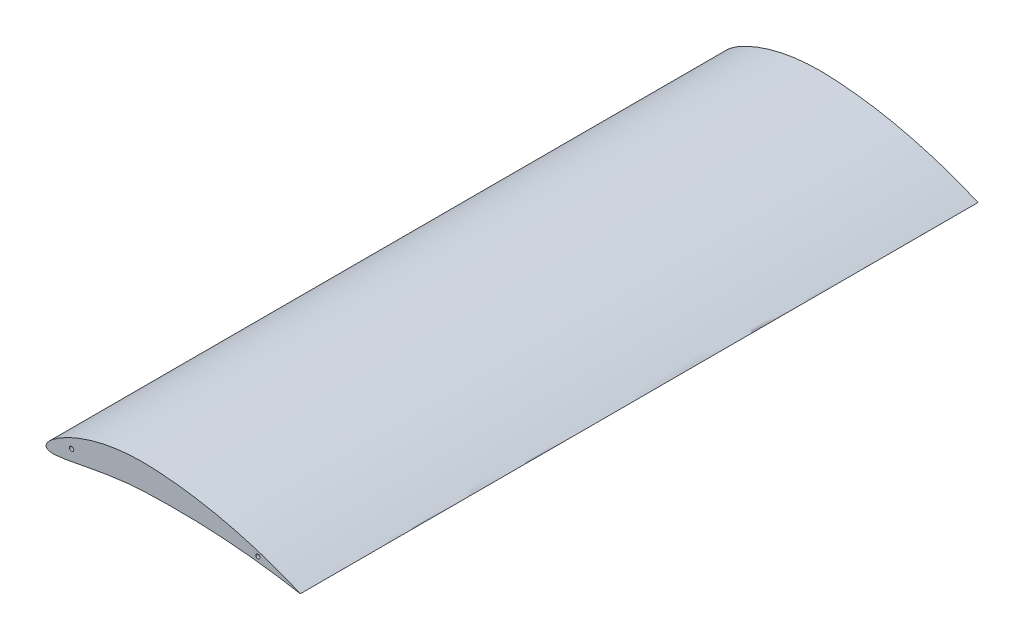
ISO-10303-21;
HEADER;
FILE_DESCRIPTION(('STEP AP214'),'2;1');
FILE_NAME('part.step','',(''),(''),'','','');
FILE_SCHEMA(('AUTOMOTIVE_DESIGN { 1 0 10303 214 1 1 1 1 }'));
ENDSEC;
DATA;
#1=APPLICATION_CONTEXT('core data for automotive mechanical design processes');
#2=APPLICATION_PROTOCOL_DEFINITION('international standard','automotive_design',2000,#1);
#3=PRODUCT_CONTEXT('',#1,'mechanical');
#4=PRODUCT('Part','Part','',(#3));
#5=PRODUCT_RELATED_PRODUCT_CATEGORY('part','',(#4));
#6=PRODUCT_DEFINITION_FORMATION('','',#4);
#7=PRODUCT_DEFINITION_CONTEXT('part definition',#1,'design');
#8=PRODUCT_DEFINITION('design','',#6,#7);
#9=PRODUCT_DEFINITION_SHAPE('','',#8);
#10=(LENGTH_UNIT() NAMED_UNIT(*) SI_UNIT(.MILLI.,.METRE.));
#11=(NAMED_UNIT(*) PLANE_ANGLE_UNIT() SI_UNIT($,.RADIAN.));
#12=(NAMED_UNIT(*) SI_UNIT($,.STERADIAN.) SOLID_ANGLE_UNIT());
#13=UNCERTAINTY_MEASURE_WITH_UNIT(LENGTH_MEASURE(1.E-05),#10,'distance_accuracy_value','');
#14=(GEOMETRIC_REPRESENTATION_CONTEXT(3) GLOBAL_UNCERTAINTY_ASSIGNED_CONTEXT((#13)) GLOBAL_UNIT_ASSIGNED_CONTEXT((#10,
#11,#12)) REPRESENTATION_CONTEXT('',''));
#15=CARTESIAN_POINT('',(0.,0.,0.));
#16=DIRECTION('',(0.,0.,1.));
#17=DIRECTION('',(1.,0.,0.));
#18=AXIS2_PLACEMENT_3D('',#15,#16,#17);
#19=CARTESIAN_POINT('',(381.,0.,1016.));
#20=CARTESIAN_POINT('',(381.004340222848,0.0145591362807944,1016.));
#21=CARTESIAN_POINT('',(380.21629181781,0.314097271895602,1016.));
#22=CARTESIAN_POINT('',(379.424259055734,0.69171266563791,1016.));
#23=CARTESIAN_POINT('',(377.451392079154,1.5124430505787,1016.));
#24=CARTESIAN_POINT('',(375.004021750885,2.55521243035525,1016.));
#25=CARTESIAN_POINT('',(371.747681331094,3.90921843302525,1016.));
#26=CARTESIAN_POINT('',(367.832953740875,5.51582566235388,1016.));
#27=CARTESIAN_POINT('',(363.219866254139,7.37027252815111,1016.));
#28=CARTESIAN_POINT('',(357.941610364703,9.44521415621842,1016.));
#29=CARTESIAN_POINT('',(352.008426614319,11.7151278596005,1016.));
#30=CARTESIAN_POINT('',(345.442389475121,14.1537165441378,1016.));
#31=CARTESIAN_POINT('',(338.264504331558,16.7309099390993,1016.));
#32=CARTESIAN_POINT('',(330.499300480987,19.4165843856592,1016.));
#33=CARTESIAN_POINT('',(322.173268115905,22.1778320686314,1016.));
#34=CARTESIAN_POINT('',(313.316034267098,24.9842723847703,1016.));
#35=CARTESIAN_POINT('',(303.958792034987,27.8026574990583,1016.));
#36=CARTESIAN_POINT('',(294.135347776989,30.6014835534793,1016.));
#37=CARTESIAN_POINT('',(283.88163874426,33.3489478025691,1016.));
#38=CARTESIAN_POINT('',(273.236002262882,36.0148808801692,1016.));
#39=CARTESIAN_POINT('',(262.238478973235,38.5691501813031,1016.));
#40=CARTESIAN_POINT('',(250.931358844502,40.9850020116605,1016.));
#41=CARTESIAN_POINT('',(239.358378298578,43.2355636529229,1016.));
#42=CARTESIAN_POINT('',(227.565235358372,45.2972327813532,1016.));
#43=CARTESIAN_POINT('',(215.599176704352,47.1482410920938,1016.));
#44=CARTESIAN_POINT('',(203.508721755538,48.7693029881569,1016.));
#45=CARTESIAN_POINT('',(191.343459712487,50.1429587370621,1016.));
#46=CARTESIAN_POINT('',(179.154308516713,51.2582640408267,1016.));
#47=CARTESIAN_POINT('',(166.992437606913,52.0989513614456,1016.));
#48=CARTESIAN_POINT('',(154.817089948257,52.681581172067,1016.));
#49=CARTESIAN_POINT('',(142.649198528401,52.9236252927755,1016.));
#50=CARTESIAN_POINT('',(130.544330170619,52.6133694724396,1016.));
#51=CARTESIAN_POINT('',(118.659752326463,51.8151920478092,1016.));
#52=CARTESIAN_POINT('',(107.079632603883,50.5408457712747,1016.));
#53=CARTESIAN_POINT('',(95.8629693128545,48.8273382783859,1016.));
#54=CARTESIAN_POINT('',(85.066049510746,46.711937306582,1016.));
#55=CARTESIAN_POINT('',(74.7419675303571,44.2411902733305,1016.));
#56=CARTESIAN_POINT('',(64.9404212569283,41.4635917038457,1016.));
#57=CARTESIAN_POINT('',(55.7072469267634,38.4324076373543,1016.));
#58=CARTESIAN_POINT('',(47.0827662098081,35.2060073281738,1016.));
#59=CARTESIAN_POINT('',(39.1047325323933,31.8392390645215,1016.));
#60=CARTESIAN_POINT('',(31.8042525894252,28.3920152697998,1016.));
#61=CARTESIAN_POINT('',(25.2087129383982,24.9209084678004,1016.));
#62=CARTESIAN_POINT('',(19.3412445079227,21.48013989049,1016.));
#63=CARTESIAN_POINT('',(14.218572236539,18.1239978287892,1016.));
#64=CARTESIAN_POINT('',(9.85486637397158,14.8989219630946,1016.));
#65=CARTESIAN_POINT('',(6.25824475254974,11.8481012137431,1016.));
#66=CARTESIAN_POINT('',(3.43162191246785,9.00760630643114,1016.));
#67=CARTESIAN_POINT('',(1.37016270187155,6.40219837510107,1016.));
#68=CARTESIAN_POINT('',(0.0665549636981991,4.03942740575516,1016.));
#69=CARTESIAN_POINT('',(-0.477618021835639,1.88209976488187,1016.));
#70=CARTESIAN_POINT('',(-0.141248619814166,-0.0636707182233826,1016.));
#71=CARTESIAN_POINT('',(1.0885425052611,-1.60290997025695,1016.));
#72=CARTESIAN_POINT('',(3.03867704220774,-2.63954541327784,1016.));
#73=CARTESIAN_POINT('',(5.62164156653744,-3.27963298164372,1016.));
#74=CARTESIAN_POINT('',(8.85774608405318,-3.57283369942892,1016.));
#75=CARTESIAN_POINT('',(12.7444989236529,-3.54305396503883,1016.));
#76=CARTESIAN_POINT('',(17.2698234762499,-3.21048247555176,1016.));
#77=CARTESIAN_POINT('',(22.4131328733662,-2.59910722897323,1016.));
#78=CARTESIAN_POINT('',(28.1499997833926,-1.73705602863584,1016.));
#79=CARTESIAN_POINT('',(34.4534667109839,-0.655314818761028,1016.));
#80=CARTESIAN_POINT('',(41.295181262609,0.610623166655933,1016.));
#81=CARTESIAN_POINT('',(48.6457678827709,2.02452557343314,1016.));
#82=CARTESIAN_POINT('',(56.4755752086816,3.54739602524784,1016.));
#83=CARTESIAN_POINT('',(64.7545371833976,5.13996146994409,1016.));
#84=CARTESIAN_POINT('',(73.4534305100211,6.76043646916639,1016.));
#85=CARTESIAN_POINT('',(82.5427404598521,8.36870026276523,1016.));
#86=CARTESIAN_POINT('',(91.9937203904642,9.92349004745468,1016.));
#87=CARTESIAN_POINT('',(101.778144580032,11.3847285908446,1016.));
#88=CARTESIAN_POINT('',(111.868113075485,12.7127696390815,1016.));
#89=CARTESIAN_POINT('',(122.235763165865,13.8730506142758,1016.));
#90=CARTESIAN_POINT('',(132.85341867079,14.8249223475618,1016.));
#91=CARTESIAN_POINT('',(143.716269303502,15.5526346325652,1016.));
#92=CARTESIAN_POINT('',(154.888235100838,15.9766350759898,1016.));
#93=CARTESIAN_POINT('',(166.325125804214,16.2709843636373,1016.));
#94=CARTESIAN_POINT('',(177.963967638109,16.4881011428272,1016.));
#95=CARTESIAN_POINT('',(189.669688109825,16.5940820974305,1016.));
#96=CARTESIAN_POINT('',(201.398985442524,16.5861483044359,1016.));
#97=CARTESIAN_POINT('',(213.10854505881,16.4570914239097,1016.));
#98=CARTESIAN_POINT('',(224.754010787811,16.2044232723607,1016.));
#99=CARTESIAN_POINT('',(236.290742624583,15.8272372500412,1016.));
#100=CARTESIAN_POINT('',(247.673894255932,15.3294369798469,1016.));
#101=CARTESIAN_POINT('',(258.858235894616,14.7167799069711,1016.));
#102=CARTESIAN_POINT('',(269.799118121078,13.9968647739362,1016.));
#103=CARTESIAN_POINT('',(280.451828214632,13.1809809890715,1016.));
#104=CARTESIAN_POINT('',(290.772868863202,12.2828357402723,1016.));
#105=CARTESIAN_POINT('',(300.718794280402,11.3157831451657,1016.));
#106=CARTESIAN_POINT('',(310.247943960612,10.2972351749477,1016.));
#107=CARTESIAN_POINT('',(319.319352665252,9.24392292979832,1016.));
#108=CARTESIAN_POINT('',(327.894020206187,8.1745298547537,1016.));
#109=CARTESIAN_POINT('',(335.934223047091,7.10638872677045,1016.));
#110=CARTESIAN_POINT('',(343.40472178312,6.05863616118624,1016.));
#111=CARTESIAN_POINT('',(350.271775357081,5.04893488977276,1016.));
#112=CARTESIAN_POINT('',(356.504977571825,4.09455078486762,1016.));
#113=CARTESIAN_POINT('',(362.073616573712,3.21087103206083,1016.));
#114=CARTESIAN_POINT('',(366.958416735399,2.41282244900088,1016.));
#115=CARTESIAN_POINT('',(371.118257333635,1.71730392663573,1016.));
#116=CARTESIAN_POINT('',(374.585771997779,1.12129144922483,1016.));
#117=CARTESIAN_POINT('',(377.204545554163,0.675636966815562,1016.));
#118=CARTESIAN_POINT('',(379.303632878696,0.28646758078465,1016.));
#119=CARTESIAN_POINT('',(380.17277989704,0.168634273563812,1016.));
#120=CARTESIAN_POINT('',(380.995658165628,-0.0145645420844985,1016.));
#121=CARTESIAN_POINT('',(381.,0.,1016.));
#122=B_SPLINE_CURVE_WITH_KNOTS('',3,(#19,#20,#21,#22,#23,#24,#25,#26,#27,#28,#29,#30,#31,#32,
#33,#34,#35,#36,#37,#38,#39,#40,#41,#42,#43,#44,#45,#46,#47,#48,#49,#50,#51,#52,#53,#54,#55,#56,
#57,#58,#59,#60,#61,#62,#63,#64,#65,#66,#67,#68,#69,#70,#71,#72,#73,#74,#75,#76,#77,#78,#79,#80,
#81,#82,#83,#84,#85,#86,#87,#88,#89,#90,#91,#92,#93,#94,#95,#96,#97,#98,#99,#100,#101,#102,#103,
#104,#105,#106,#107,#108,#109,#110,#111,#112,#113,#114,#115,#116,#117,#118,#119,#120,#121),
.UNSPECIFIED.,.T.,.F.,(4,1,1,1,1,1,1,1,1,1,1,1,1,1,1,1,1,1,1,1,1,1,1,1,1,1,1,1,1,1,1,1,1,1,1,1,
1,1,1,1,1,1,1,1,1,1,1,1,1,1,1,1,1,1,1,1,1,1,1,1,1,1,1,1,1,1,1,1,1,1,1,1,1,1,1,1,1,1,1,1,1,1,1,1,
1,1,1,1,1,1,1,1,1,1,1,1,1,1,1,1,4),(0.,0.000500326049519143,0.00199990760163715,
0.00449101627273274,0.00796298086574612,0.0124002118425483,0.0177826366211744,
0.0240860326313179,0.0312831052168073,0.0393424270236328,0.0482285836149498,0.057904259586067,
0.0683279588406354,0.0794565200862166,0.0912430416416612,0.103640125631855,0.11659760446237,
0.130063468683702,0.143984589749349,0.158306115281006,0.172972351114055,0.187927319554514,
0.20311311609449,0.21847170022127,0.233944808256595,0.249473445037778,0.264998854871646,
0.280462152993957,0.295803844975311,0.311323628717017,0.326706508328528,0.341810405087739,
0.356582637386559,0.370971506072796,0.38492377668075,0.398386752583945,0.411306988431166,
0.423632653932156,0.435311864853231,0.446295011418478,0.456534872077711,0.465987533398347,
0.474613040323127,0.482377355112773,0.489253053218404,0.495223640795803,0.500285940491078,
0.504461055430133,0.507811561379389,0.510480593826733,0.512762221689423,0.515043424046115,
0.517702036811693,0.521013381255434,0.525103947691201,0.530021122126523,0.535771893077695,
0.542341397137363,0.549702684379151,0.557818571065016,0.566648243037682,0.576147103665607,
0.586268140188205,0.596964793437867,0.608189910026611,0.619898639505957,0.632046652594614,
0.644592153625543,0.657497245151002,0.670724392767715,0.684239662545191,0.698010812754851,
0.712098303326406,0.726728065548618,0.741493630132347,0.756341332592584,0.77121932541031,
0.786072643114755,0.800847936994409,0.815489997805182,0.829943037606439,0.844152553752633,
0.858061385805725,0.871615338111085,0.884758319653612,0.897436299434092,0.909594640457841,
0.921181699282087,0.932145358799731,0.942436617257412,0.952008463169593,0.960816148037907,
0.968817229154603,0.975973664666453,0.982250117606877,0.987615555936445,0.992043304182074,
0.995510912453481,0.998000497540123,0.999499488179542,1.),.UNSPECIFIED.);
#123=DIRECTION('',(0.,0.,-1.));
#124=VECTOR('',#123,1.);
#125=SURFACE_OF_LINEAR_EXTRUSION('',#122,#124);
#126=CARTESIAN_POINT('',(381.,0.,1016.));
#127=VERTEX_POINT('',#126);
#128=EDGE_CURVE('E10',#127,#127,#122,.T.);
#129=ORIENTED_EDGE('',*,*,#128,.F.);
#130=EDGE_LOOP('',(#129));
#131=FACE_BOUND('',#130,.T.);
#132=CARTESIAN_POINT('',(381.,0.,0.));
#133=CARTESIAN_POINT('',(381.004340222848,0.0145591362807944,0.));
#134=CARTESIAN_POINT('',(380.21629181781,0.314097271895602,0.));
#135=CARTESIAN_POINT('',(379.424259055734,0.69171266563791,0.));
#136=CARTESIAN_POINT('',(377.451392079154,1.5124430505787,0.));
#137=CARTESIAN_POINT('',(375.004021750885,2.55521243035525,0.));
#138=CARTESIAN_POINT('',(371.747681331094,3.90921843302525,0.));
#139=CARTESIAN_POINT('',(367.832953740875,5.51582566235388,0.));
#140=CARTESIAN_POINT('',(363.219866254139,7.37027252815111,0.));
#141=CARTESIAN_POINT('',(357.941610364703,9.44521415621842,0.));
#142=CARTESIAN_POINT('',(352.008426614319,11.7151278596005,0.));
#143=CARTESIAN_POINT('',(345.442389475121,14.1537165441378,0.));
#144=CARTESIAN_POINT('',(338.264504331558,16.7309099390993,0.));
#145=CARTESIAN_POINT('',(330.499300480987,19.4165843856592,0.));
#146=CARTESIAN_POINT('',(322.173268115905,22.1778320686314,0.));
#147=CARTESIAN_POINT('',(313.316034267098,24.9842723847703,0.));
#148=CARTESIAN_POINT('',(303.958792034987,27.8026574990583,0.));
#149=CARTESIAN_POINT('',(294.135347776989,30.6014835534793,0.));
#150=CARTESIAN_POINT('',(283.88163874426,33.3489478025691,0.));
#151=CARTESIAN_POINT('',(273.236002262882,36.0148808801692,0.));
#152=CARTESIAN_POINT('',(262.238478973235,38.5691501813031,0.));
#153=CARTESIAN_POINT('',(250.931358844502,40.9850020116605,0.));
#154=CARTESIAN_POINT('',(239.358378298578,43.2355636529229,0.));
#155=CARTESIAN_POINT('',(227.565235358372,45.2972327813532,0.));
#156=CARTESIAN_POINT('',(215.599176704352,47.1482410920938,0.));
#157=CARTESIAN_POINT('',(203.508721755538,48.7693029881569,0.));
#158=CARTESIAN_POINT('',(191.343459712487,50.1429587370621,0.));
#159=CARTESIAN_POINT('',(179.154308516713,51.2582640408267,0.));
#160=CARTESIAN_POINT('',(166.992437606913,52.0989513614456,0.));
#161=CARTESIAN_POINT('',(154.817089948257,52.681581172067,0.));
#162=CARTESIAN_POINT('',(142.649198528401,52.9236252927755,0.));
#163=CARTESIAN_POINT('',(130.544330170619,52.6133694724396,0.));
#164=CARTESIAN_POINT('',(118.659752326463,51.8151920478092,0.));
#165=CARTESIAN_POINT('',(107.079632603883,50.5408457712747,0.));
#166=CARTESIAN_POINT('',(95.8629693128545,48.8273382783859,0.));
#167=CARTESIAN_POINT('',(85.066049510746,46.711937306582,0.));
#168=CARTESIAN_POINT('',(74.7419675303571,44.2411902733305,0.));
#169=CARTESIAN_POINT('',(64.9404212569283,41.4635917038457,0.));
#170=CARTESIAN_POINT('',(55.7072469267634,38.4324076373543,0.));
#171=CARTESIAN_POINT('',(47.0827662098081,35.2060073281738,0.));
#172=CARTESIAN_POINT('',(39.1047325323933,31.8392390645215,0.));
#173=CARTESIAN_POINT('',(31.8042525894252,28.3920152697998,0.));
#174=CARTESIAN_POINT('',(25.2087129383982,24.9209084678004,0.));
#175=CARTESIAN_POINT('',(19.3412445079227,21.48013989049,0.));
#176=CARTESIAN_POINT('',(14.218572236539,18.1239978287892,0.));
#177=CARTESIAN_POINT('',(9.85486637397158,14.8989219630946,0.));
#178=CARTESIAN_POINT('',(6.25824475254974,11.8481012137431,0.));
#179=CARTESIAN_POINT('',(3.43162191246785,9.00760630643114,0.));
#180=CARTESIAN_POINT('',(1.37016270187155,6.40219837510107,0.));
#181=CARTESIAN_POINT('',(0.0665549636981991,4.03942740575516,0.));
#182=CARTESIAN_POINT('',(-0.477618021835639,1.88209976488187,0.));
#183=CARTESIAN_POINT('',(-0.141248619814166,-0.0636707182233826,0.));
#184=CARTESIAN_POINT('',(1.0885425052611,-1.60290997025695,0.));
#185=CARTESIAN_POINT('',(3.03867704220774,-2.63954541327784,0.));
#186=CARTESIAN_POINT('',(5.62164156653744,-3.27963298164372,0.));
#187=CARTESIAN_POINT('',(8.85774608405318,-3.57283369942892,0.));
#188=CARTESIAN_POINT('',(12.7444989236529,-3.54305396503883,0.));
#189=CARTESIAN_POINT('',(17.2698234762499,-3.21048247555176,0.));
#190=CARTESIAN_POINT('',(22.4131328733662,-2.59910722897323,0.));
#191=CARTESIAN_POINT('',(28.1499997833926,-1.73705602863584,0.));
#192=CARTESIAN_POINT('',(34.4534667109839,-0.655314818761028,0.));
#193=CARTESIAN_POINT('',(41.295181262609,0.610623166655933,0.));
#194=CARTESIAN_POINT('',(48.6457678827709,2.02452557343314,0.));
#195=CARTESIAN_POINT('',(56.4755752086816,3.54739602524784,0.));
#196=CARTESIAN_POINT('',(64.7545371833976,5.13996146994409,0.));
#197=CARTESIAN_POINT('',(73.4534305100211,6.76043646916639,0.));
#198=CARTESIAN_POINT('',(82.5427404598521,8.36870026276523,0.));
#199=CARTESIAN_POINT('',(91.9937203904642,9.92349004745468,0.));
#200=CARTESIAN_POINT('',(101.778144580032,11.3847285908446,0.));
#201=CARTESIAN_POINT('',(111.868113075485,12.7127696390815,0.));
#202=CARTESIAN_POINT('',(122.235763165865,13.8730506142758,0.));
#203=CARTESIAN_POINT('',(132.85341867079,14.8249223475618,0.));
#204=CARTESIAN_POINT('',(143.716269303502,15.5526346325652,0.));
#205=CARTESIAN_POINT('',(154.888235100838,15.9766350759898,0.));
#206=CARTESIAN_POINT('',(166.325125804214,16.2709843636373,0.));
#207=CARTESIAN_POINT('',(177.963967638109,16.4881011428272,0.));
#208=CARTESIAN_POINT('',(189.669688109825,16.5940820974305,0.));
#209=CARTESIAN_POINT('',(201.398985442524,16.5861483044359,0.));
#210=CARTESIAN_POINT('',(213.10854505881,16.4570914239097,0.));
#211=CARTESIAN_POINT('',(224.754010787811,16.2044232723607,0.));
#212=CARTESIAN_POINT('',(236.290742624583,15.8272372500412,0.));
#213=CARTESIAN_POINT('',(247.673894255932,15.3294369798469,0.));
#214=CARTESIAN_POINT('',(258.858235894616,14.7167799069711,0.));
#215=CARTESIAN_POINT('',(269.799118121078,13.9968647739362,0.));
#216=CARTESIAN_POINT('',(280.451828214632,13.1809809890715,0.));
#217=CARTESIAN_POINT('',(290.772868863202,12.2828357402723,0.));
#218=CARTESIAN_POINT('',(300.718794280402,11.3157831451657,0.));
#219=CARTESIAN_POINT('',(310.247943960612,10.2972351749477,0.));
#220=CARTESIAN_POINT('',(319.319352665252,9.24392292979832,0.));
#221=CARTESIAN_POINT('',(327.894020206187,8.1745298547537,0.));
#222=CARTESIAN_POINT('',(335.934223047091,7.10638872677045,0.));
#223=CARTESIAN_POINT('',(343.40472178312,6.05863616118624,0.));
#224=CARTESIAN_POINT('',(350.271775357081,5.04893488977276,0.));
#225=CARTESIAN_POINT('',(356.504977571825,4.09455078486762,0.));
#226=CARTESIAN_POINT('',(362.073616573712,3.21087103206083,0.));
#227=CARTESIAN_POINT('',(366.958416735399,2.41282244900088,0.));
#228=CARTESIAN_POINT('',(371.118257333635,1.71730392663573,0.));
#229=CARTESIAN_POINT('',(374.585771997779,1.12129144922483,0.));
#230=CARTESIAN_POINT('',(377.204545554163,0.675636966815562,0.));
#231=CARTESIAN_POINT('',(379.303632878696,0.28646758078465,0.));
#232=CARTESIAN_POINT('',(380.17277989704,0.168634273563812,0.));
#233=CARTESIAN_POINT('',(380.995658165628,-0.0145645420844985,0.));
#234=CARTESIAN_POINT('',(381.,0.,0.));
#235=B_SPLINE_CURVE_WITH_KNOTS('',3,(#132,#133,#134,#135,#136,#137,#138,#139,#140,#141,#142,
#143,#144,#145,#146,#147,#148,#149,#150,#151,#152,#153,#154,#155,#156,#157,#158,#159,#160,#161,
#162,#163,#164,#165,#166,#167,#168,#169,#170,#171,#172,#173,#174,#175,#176,#177,#178,#179,#180,
#181,#182,#183,#184,#185,#186,#187,#188,#189,#190,#191,#192,#193,#194,#195,#196,#197,#198,#199,
#200,#201,#202,#203,#204,#205,#206,#207,#208,#209,#210,#211,#212,#213,#214,#215,#216,#217,#218,
#219,#220,#221,#222,#223,#224,#225,#226,#227,#228,#229,#230,#231,#232,#233,#234),.UNSPECIFIED.,
.T.,.F.,(4,1,1,1,1,1,1,1,1,1,1,1,1,1,1,1,1,1,1,1,1,1,1,1,1,1,1,1,1,1,1,1,1,1,1,1,1,1,1,1,1,1,1,
1,1,1,1,1,1,1,1,1,1,1,1,1,1,1,1,1,1,1,1,1,1,1,1,1,1,1,1,1,1,1,1,1,1,1,1,1,1,1,1,1,1,1,1,1,1,1,1,
1,1,1,1,1,1,1,1,1,4),(0.,0.000500326049519143,0.00199990760163715,0.00449101627273274,
0.00796298086574612,0.0124002118425483,0.0177826366211744,0.0240860326313179,0.0312831052168073,
0.0393424270236328,0.0482285836149498,0.057904259586067,0.0683279588406354,0.0794565200862166,
0.0912430416416612,0.103640125631855,0.11659760446237,0.130063468683702,0.143984589749349,
0.158306115281006,0.172972351114055,0.187927319554514,0.20311311609449,0.21847170022127,
0.233944808256595,0.249473445037778,0.264998854871646,0.280462152993957,0.295803844975311,
0.311323628717017,0.326706508328528,0.341810405087739,0.356582637386559,0.370971506072796,
0.38492377668075,0.398386752583945,0.411306988431166,0.423632653932156,0.435311864853231,
0.446295011418478,0.456534872077711,0.465987533398347,0.474613040323127,0.482377355112773,
0.489253053218404,0.495223640795803,0.500285940491078,0.504461055430133,0.507811561379389,
0.510480593826733,0.512762221689423,0.515043424046115,0.517702036811693,0.521013381255434,
0.525103947691201,0.530021122126523,0.535771893077695,0.542341397137363,0.549702684379151,
0.557818571065016,0.566648243037682,0.576147103665607,0.586268140188205,0.596964793437867,
0.608189910026611,0.619898639505957,0.632046652594614,0.644592153625543,0.657497245151002,
0.670724392767715,0.684239662545191,0.698010812754851,0.712098303326406,0.726728065548618,
0.741493630132347,0.756341332592584,0.77121932541031,0.786072643114755,0.800847936994409,
0.815489997805182,0.829943037606439,0.844152553752633,0.858061385805725,0.871615338111085,
0.884758319653612,0.897436299434092,0.909594640457841,0.921181699282087,0.932145358799731,
0.942436617257412,0.952008463169593,0.960816148037907,0.968817229154603,0.975973664666453,
0.982250117606877,0.987615555936445,0.992043304182074,0.995510912453481,0.998000497540123,
0.999499488179542,1.),.UNSPECIFIED.);
#236=CARTESIAN_POINT('',(381.,0.,0.));
#237=VERTEX_POINT('',#236);
#238=EDGE_CURVE('E36',#237,#237,#235,.T.);
#239=ORIENTED_EDGE('',*,*,#238,.T.);
#240=EDGE_LOOP('',(#239));
#241=FACE_BOUND('',#240,.T.);
#242=ADVANCED_FACE('F32',(#131,#241),#125,.F.);
#243=CARTESIAN_POINT('',(3.47766633356919,8.95504392487584,1016.));
#244=DIRECTION('',(0.,0.,-1.));
#245=DIRECTION('',(-1.,0.,0.));
#246=AXIS2_PLACEMENT_3D('',#243,#244,#245);
#247=PLANE('',#246);
#248=CARTESIAN_POINT('',(37.9397539767991,16.5855317499963,1016.));
#249=DIRECTION('',(0.,0.,-1.));
#250=DIRECTION('',(-1.,0.,0.));
#251=AXIS2_PLACEMENT_3D('',#248,#249,#250);
#252=CIRCLE('',#251,3.175);
#253=CARTESIAN_POINT('',(34.7647539767991,16.5855317499963,1016.));
#254=VERTEX_POINT('',#253);
#255=EDGE_CURVE('E44',#254,#254,#252,.F.);
#256=ORIENTED_EDGE('',*,*,#255,.F.);
#257=EDGE_LOOP('',(#256));
#258=FACE_BOUND('',#257,.T.);
#259=CARTESIAN_POINT('',(317.339753976799,16.5855317499963,1016.));
#260=DIRECTION('',(0.,0.,-1.));
#261=DIRECTION('',(-1.,0.,0.));
#262=AXIS2_PLACEMENT_3D('',#259,#260,#261);
#263=CIRCLE('',#262,3.17499999999997);
#264=CARTESIAN_POINT('',(314.164753976799,16.5855317499963,1016.));
#265=VERTEX_POINT('',#264);
#266=EDGE_CURVE('E49',#265,#265,#263,.F.);
#267=ORIENTED_EDGE('',*,*,#266,.F.);
#268=EDGE_LOOP('',(#267));
#269=FACE_BOUND('',#268,.T.);
#270=ORIENTED_EDGE('',*,*,#128,.T.);
#271=EDGE_LOOP('',(#270));
#272=FACE_BOUND('',#271,.T.);
#273=ADVANCED_FACE('F71',(#258,#269,#272),#247,.F.);
#274=CARTESIAN_POINT('',(3.47766633356919,8.95504392487584,0.));
#275=DIRECTION('',(0.,0.,-1.));
#276=DIRECTION('',(-1.,0.,0.));
#277=AXIS2_PLACEMENT_3D('',#274,#275,#276);
#278=PLANE('',#277);
#279=CARTESIAN_POINT('',(37.9397539767991,16.5855317499963,0.));
#280=DIRECTION('',(0.,0.,-1.));
#281=DIRECTION('',(-1.,0.,0.));
#282=AXIS2_PLACEMENT_3D('',#279,#280,#281);
#283=CIRCLE('',#282,3.175);
#284=CARTESIAN_POINT('',(34.7647539767991,16.5855317499963,0.));
#285=VERTEX_POINT('',#284);
#286=EDGE_CURVE('E55',#285,#285,#283,.T.);
#287=ORIENTED_EDGE('',*,*,#286,.F.);
#288=EDGE_LOOP('',(#287));
#289=FACE_BOUND('',#288,.T.);
#290=CARTESIAN_POINT('',(317.339753976799,16.5855317499963,0.));
#291=DIRECTION('',(0.,0.,-1.));
#292=DIRECTION('',(-1.,0.,0.));
#293=AXIS2_PLACEMENT_3D('',#290,#291,#292);
#294=CIRCLE('',#293,3.17499999999997);
#295=CARTESIAN_POINT('',(314.164753976799,16.5855317499963,0.));
#296=VERTEX_POINT('',#295);
#297=EDGE_CURVE('E56',#296,#296,#294,.T.);
#298=ORIENTED_EDGE('',*,*,#297,.F.);
#299=EDGE_LOOP('',(#298));
#300=FACE_BOUND('',#299,.T.);
#301=ORIENTED_EDGE('',*,*,#238,.F.);
#302=EDGE_LOOP('',(#301));
#303=FACE_BOUND('',#302,.T.);
#304=ADVANCED_FACE('F67',(#289,#300,#303),#278,.T.);
#305=CARTESIAN_POINT('',(317.339753976799,16.5855317499963,1016.001));
#306=DIRECTION('',(0.,0.,-1.));
#307=DIRECTION('',(-1.,0.,0.));
#308=AXIS2_PLACEMENT_3D('',#305,#306,#307);
#309=CYLINDRICAL_SURFACE('',#308,3.17499999999997);
#310=ORIENTED_EDGE('',*,*,#297,.T.);
#311=EDGE_LOOP('',(#310));
#312=FACE_BOUND('',#311,.T.);
#313=ORIENTED_EDGE('',*,*,#266,.T.);
#314=EDGE_LOOP('',(#313));
#315=FACE_BOUND('',#314,.T.);
#316=ADVANCED_FACE('F70',(#312,#315),#309,.F.);
#317=CARTESIAN_POINT('',(37.9397539767991,16.5855317499963,1016.001));
#318=DIRECTION('',(0.,0.,-1.));
#319=DIRECTION('',(-1.,0.,0.));
#320=AXIS2_PLACEMENT_3D('',#317,#318,#319);
#321=CYLINDRICAL_SURFACE('',#320,3.175);
#322=ORIENTED_EDGE('',*,*,#286,.T.);
#323=EDGE_LOOP('',(#322));
#324=FACE_BOUND('',#323,.T.);
#325=ORIENTED_EDGE('',*,*,#255,.T.);
#326=EDGE_LOOP('',(#325));
#327=FACE_BOUND('',#326,.T.);
#328=ADVANCED_FACE('F64',(#324,#327),#321,.F.);
#329=CLOSED_SHELL('',(#242,#273,#304,#316,#328));
#330=MANIFOLD_SOLID_BREP('B2',#329);
#331=ADVANCED_BREP_SHAPE_REPRESENTATION('',(#18,#330),#14);
#332=SHAPE_DEFINITION_REPRESENTATION(#9,#331);
ENDSEC;
END-ISO-10303-21;
